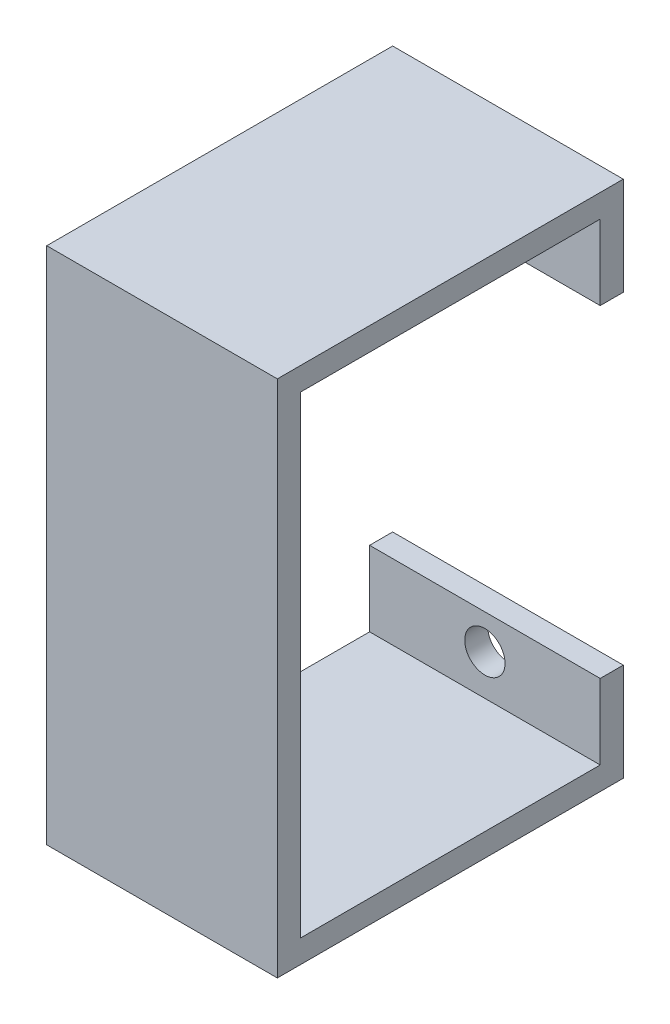
ISO-10303-21;
HEADER;
FILE_DESCRIPTION(('STEP AP214'),'2;1');
FILE_NAME('part.step','',(''),(''),'','','');
FILE_SCHEMA(('AUTOMOTIVE_DESIGN { 1 0 10303 214 1 1 1 1 }'));
ENDSEC;
DATA;
#1=APPLICATION_CONTEXT('core data for automotive mechanical design processes');
#2=APPLICATION_PROTOCOL_DEFINITION('international standard','automotive_design',2000,#1);
#3=PRODUCT_CONTEXT('',#1,'mechanical');
#4=PRODUCT('Part','Part','',(#3));
#5=PRODUCT_RELATED_PRODUCT_CATEGORY('part','',(#4));
#6=PRODUCT_DEFINITION_FORMATION('','',#4);
#7=PRODUCT_DEFINITION_CONTEXT('part definition',#1,'design');
#8=PRODUCT_DEFINITION('design','',#6,#7);
#9=PRODUCT_DEFINITION_SHAPE('','',#8);
#10=(LENGTH_UNIT() NAMED_UNIT(*) SI_UNIT(.MILLI.,.METRE.));
#11=(NAMED_UNIT(*) PLANE_ANGLE_UNIT() SI_UNIT($,.RADIAN.));
#12=(NAMED_UNIT(*) SI_UNIT($,.STERADIAN.) SOLID_ANGLE_UNIT());
#13=UNCERTAINTY_MEASURE_WITH_UNIT(LENGTH_MEASURE(1.E-05),#10,'distance_accuracy_value','');
#14=(GEOMETRIC_REPRESENTATION_CONTEXT(3) GLOBAL_UNCERTAINTY_ASSIGNED_CONTEXT((#13)) GLOBAL_UNIT_ASSIGNED_CONTEXT((#10,
#11,#12)) REPRESENTATION_CONTEXT('',''));
#15=CARTESIAN_POINT('',(0.,0.,0.));
#16=DIRECTION('',(0.,0.,1.));
#17=DIRECTION('',(1.,0.,0.));
#18=AXIS2_PLACEMENT_3D('',#15,#16,#17);
#19=CARTESIAN_POINT('',(10.,-14.,2.));
#20=DIRECTION('',(0.,-1.,0.));
#21=DIRECTION('',(0.,0.,-1.));
#22=AXIS2_PLACEMENT_3D('',#19,#20,#21);
#23=PLANE('',#22);
#24=DIRECTION('',(0.,0.,1.));
#25=VECTOR('',#24,1.);
#26=CARTESIAN_POINT('',(-10.,-14.,2.));
#27=LINE('',#26,#25);
#28=CARTESIAN_POINT('',(-10.,-14.,0.));
#29=VERTEX_POINT('',#28);
#30=CARTESIAN_POINT('',(-10.,-14.,2.));
#31=VERTEX_POINT('',#30);
#32=EDGE_CURVE('E153',#29,#31,#27,.T.);
#33=ORIENTED_EDGE('',*,*,#32,.T.);
#34=DIRECTION('',(-1.,0.,0.));
#35=VECTOR('',#34,1.);
#36=CARTESIAN_POINT('',(10.,-14.,2.));
#37=LINE('',#36,#35);
#38=CARTESIAN_POINT('',(10.,-14.,2.));
#39=VERTEX_POINT('',#38);
#40=EDGE_CURVE('E11',#39,#31,#37,.T.);
#41=ORIENTED_EDGE('',*,*,#40,.F.);
#42=DIRECTION('',(0.,0.,1.));
#43=VECTOR('',#42,1.);
#44=CARTESIAN_POINT('',(10.,-14.,2.));
#45=LINE('',#44,#43);
#46=CARTESIAN_POINT('',(10.,-14.,0.));
#47=VERTEX_POINT('',#46);
#48=EDGE_CURVE('E176',#47,#39,#45,.T.);
#49=ORIENTED_EDGE('',*,*,#48,.F.);
#50=DIRECTION('',(-1.,0.,0.));
#51=VECTOR('',#50,1.);
#52=CARTESIAN_POINT('',(10.,-14.,0.));
#53=LINE('',#52,#51);
#54=EDGE_CURVE('E149',#47,#29,#53,.T.);
#55=ORIENTED_EDGE('',*,*,#54,.T.);
#56=EDGE_LOOP('',(#33,#41,#49,#55));
#57=FACE_BOUND('',#56,.T.);
#58=ADVANCED_FACE('F33',(#57),#23,.F.);
#59=CARTESIAN_POINT('',(10.,-14.,2.));
#60=DIRECTION('',(0.,0.,-1.));
#61=DIRECTION('',(0.,1.,0.));
#62=AXIS2_PLACEMENT_3D('',#59,#60,#61);
#63=PLANE('',#62);
#64=CARTESIAN_POINT('',(0.,-17.,2.));
#65=DIRECTION('',(0.,0.,1.));
#66=DIRECTION('',(1.,0.,0.));
#67=AXIS2_PLACEMENT_3D('',#64,#65,#66);
#68=CIRCLE('',#67,1.75);
#69=CARTESIAN_POINT('',(1.75,-17.,2.));
#70=VERTEX_POINT('',#69);
#71=EDGE_CURVE('E363',#70,#70,#68,.T.);
#72=ORIENTED_EDGE('',*,*,#71,.F.);
#73=EDGE_LOOP('',(#72));
#74=FACE_BOUND('',#73,.T.);
#75=DIRECTION('',(0.,-1.,0.));
#76=VECTOR('',#75,1.);
#77=CARTESIAN_POINT('',(-10.,-14.,2.));
#78=LINE('',#77,#76);
#79=CARTESIAN_POINT('',(-10.,-20.5,2.));
#80=VERTEX_POINT('',#79);
#81=EDGE_CURVE('E156',#31,#80,#78,.T.);
#82=ORIENTED_EDGE('',*,*,#81,.T.);
#83=DIRECTION('',(-1.,0.,0.));
#84=VECTOR('',#83,1.);
#85=CARTESIAN_POINT('',(10.,-20.5,2.));
#86=LINE('',#85,#84);
#87=CARTESIAN_POINT('',(10.,-20.5,2.));
#88=VERTEX_POINT('',#87);
#89=EDGE_CURVE('E41',#88,#80,#86,.T.);
#90=ORIENTED_EDGE('',*,*,#89,.F.);
#91=DIRECTION('',(0.,-1.,0.));
#92=VECTOR('',#91,1.);
#93=CARTESIAN_POINT('',(10.,-14.,2.));
#94=LINE('',#93,#92);
#95=EDGE_CURVE('E104',#39,#88,#94,.T.);
#96=ORIENTED_EDGE('',*,*,#95,.F.);
#97=ORIENTED_EDGE('',*,*,#40,.T.);
#98=EDGE_LOOP('',(#82,#90,#96,#97));
#99=FACE_BOUND('',#98,.T.);
#100=ADVANCED_FACE('F256',(#74,#99),#63,.F.);
#101=CARTESIAN_POINT('',(10.,-20.5,2.));
#102=DIRECTION('',(0.,-1.,0.));
#103=DIRECTION('',(0.,0.,-1.));
#104=AXIS2_PLACEMENT_3D('',#101,#102,#103);
#105=PLANE('',#104);
#106=DIRECTION('',(0.,0.,1.));
#107=VECTOR('',#106,1.);
#108=CARTESIAN_POINT('',(-10.,-20.5,2.));
#109=LINE('',#108,#107);
#110=CARTESIAN_POINT('',(-10.,-20.5,28.));
#111=VERTEX_POINT('',#110);
#112=EDGE_CURVE('E159',#80,#111,#109,.T.);
#113=ORIENTED_EDGE('',*,*,#112,.T.);
#114=DIRECTION('',(-1.,0.,0.));
#115=VECTOR('',#114,1.);
#116=CARTESIAN_POINT('',(10.,-20.5,28.));
#117=LINE('',#116,#115);
#118=CARTESIAN_POINT('',(10.,-20.5,28.));
#119=VERTEX_POINT('',#118);
#120=EDGE_CURVE('E195',#119,#111,#117,.T.);
#121=ORIENTED_EDGE('',*,*,#120,.F.);
#122=DIRECTION('',(0.,0.,1.));
#123=VECTOR('',#122,1.);
#124=CARTESIAN_POINT('',(10.,-20.5,2.));
#125=LINE('',#124,#123);
#126=EDGE_CURVE('E203',#88,#119,#125,.T.);
#127=ORIENTED_EDGE('',*,*,#126,.F.);
#128=ORIENTED_EDGE('',*,*,#89,.T.);
#129=EDGE_LOOP('',(#113,#121,#127,#128));
#130=FACE_BOUND('',#129,.T.);
#131=ADVANCED_FACE('F201',(#130),#105,.F.);
#132=CARTESIAN_POINT('',(10.,-20.5,28.));
#133=DIRECTION('',(0.,0.,1.));
#134=DIRECTION('',(1.,0.,0.));
#135=AXIS2_PLACEMENT_3D('',#132,#133,#134);
#136=PLANE('',#135);
#137=DIRECTION('',(0.,1.,0.));
#138=VECTOR('',#137,1.);
#139=CARTESIAN_POINT('',(-10.,-20.5,28.));
#140=LINE('',#139,#138);
#141=CARTESIAN_POINT('',(-10.,20.5,28.));
#142=VERTEX_POINT('',#141);
#143=EDGE_CURVE('E161',#111,#142,#140,.T.);
#144=ORIENTED_EDGE('',*,*,#143,.T.);
#145=DIRECTION('',(-1.,0.,0.));
#146=VECTOR('',#145,1.);
#147=CARTESIAN_POINT('',(10.,20.5,28.));
#148=LINE('',#147,#146);
#149=CARTESIAN_POINT('',(10.,20.5,28.));
#150=VERTEX_POINT('',#149);
#151=EDGE_CURVE('E192',#150,#142,#148,.T.);
#152=ORIENTED_EDGE('',*,*,#151,.F.);
#153=DIRECTION('',(0.,1.,0.));
#154=VECTOR('',#153,1.);
#155=CARTESIAN_POINT('',(10.,-20.5,28.));
#156=LINE('',#155,#154);
#157=EDGE_CURVE('E221',#119,#150,#156,.T.);
#158=ORIENTED_EDGE('',*,*,#157,.F.);
#159=ORIENTED_EDGE('',*,*,#120,.T.);
#160=EDGE_LOOP('',(#144,#152,#158,#159));
#161=FACE_BOUND('',#160,.T.);
#162=ADVANCED_FACE('F212',(#161),#136,.F.);
#163=CARTESIAN_POINT('',(10.,20.5,28.));
#164=DIRECTION('',(0.,1.,0.));
#165=DIRECTION('',(0.,0.,1.));
#166=AXIS2_PLACEMENT_3D('',#163,#164,#165);
#167=PLANE('',#166);
#168=DIRECTION('',(0.,0.,-1.));
#169=VECTOR('',#168,1.);
#170=CARTESIAN_POINT('',(-10.,20.5,28.));
#171=LINE('',#170,#169);
#172=CARTESIAN_POINT('',(-10.,20.5,2.));
#173=VERTEX_POINT('',#172);
#174=EDGE_CURVE('E163',#142,#173,#171,.T.);
#175=ORIENTED_EDGE('',*,*,#174,.T.);
#176=DIRECTION('',(-1.,0.,0.));
#177=VECTOR('',#176,1.);
#178=CARTESIAN_POINT('',(10.,20.5,2.));
#179=LINE('',#178,#177);
#180=CARTESIAN_POINT('',(10.,20.5,2.));
#181=VERTEX_POINT('',#180);
#182=EDGE_CURVE('E189',#181,#173,#179,.T.);
#183=ORIENTED_EDGE('',*,*,#182,.F.);
#184=DIRECTION('',(0.,0.,-1.));
#185=VECTOR('',#184,1.);
#186=CARTESIAN_POINT('',(10.,20.5,28.));
#187=LINE('',#186,#185);
#188=EDGE_CURVE('E218',#150,#181,#187,.T.);
#189=ORIENTED_EDGE('',*,*,#188,.F.);
#190=ORIENTED_EDGE('',*,*,#151,.T.);
#191=EDGE_LOOP('',(#175,#183,#189,#190));
#192=FACE_BOUND('',#191,.T.);
#193=ADVANCED_FACE('F216',(#192),#167,.F.);
#194=CARTESIAN_POINT('',(10.,20.5,2.));
#195=DIRECTION('',(0.,0.,-1.));
#196=DIRECTION('',(-1.,0.,0.));
#197=AXIS2_PLACEMENT_3D('',#194,#195,#196);
#198=PLANE('',#197);
#199=CARTESIAN_POINT('',(0.,17.,2.));
#200=DIRECTION('',(0.,0.,1.));
#201=DIRECTION('',(-1.,0.,0.));
#202=AXIS2_PLACEMENT_3D('',#199,#200,#201);
#203=CIRCLE('',#202,1.75);
#204=CARTESIAN_POINT('',(-1.75,17.,2.));
#205=VERTEX_POINT('',#204);
#206=EDGE_CURVE('E361',#205,#205,#203,.T.);
#207=ORIENTED_EDGE('',*,*,#206,.F.);
#208=EDGE_LOOP('',(#207));
#209=FACE_BOUND('',#208,.T.);
#210=DIRECTION('',(0.,-1.,0.));
#211=VECTOR('',#210,1.);
#212=CARTESIAN_POINT('',(-10.,20.5,2.));
#213=LINE('',#212,#211);
#214=CARTESIAN_POINT('',(-10.,14.,2.));
#215=VERTEX_POINT('',#214);
#216=EDGE_CURVE('E165',#173,#215,#213,.T.);
#217=ORIENTED_EDGE('',*,*,#216,.T.);
#218=DIRECTION('',(-1.,0.,0.));
#219=VECTOR('',#218,1.);
#220=CARTESIAN_POINT('',(10.,14.,2.));
#221=LINE('',#220,#219);
#222=CARTESIAN_POINT('',(10.,14.,2.));
#223=VERTEX_POINT('',#222);
#224=EDGE_CURVE('E186',#223,#215,#221,.T.);
#225=ORIENTED_EDGE('',*,*,#224,.F.);
#226=DIRECTION('',(0.,-1.,0.));
#227=VECTOR('',#226,1.);
#228=CARTESIAN_POINT('',(10.,20.5,2.));
#229=LINE('',#228,#227);
#230=EDGE_CURVE('E220',#181,#223,#229,.T.);
#231=ORIENTED_EDGE('',*,*,#230,.F.);
#232=ORIENTED_EDGE('',*,*,#182,.T.);
#233=EDGE_LOOP('',(#217,#225,#231,#232));
#234=FACE_BOUND('',#233,.T.);
#235=ADVANCED_FACE('F271',(#209,#234),#198,.F.);
#236=CARTESIAN_POINT('',(10.,14.,2.));
#237=DIRECTION('',(0.,1.,0.));
#238=DIRECTION('',(0.,0.,1.));
#239=AXIS2_PLACEMENT_3D('',#236,#237,#238);
#240=PLANE('',#239);
#241=DIRECTION('',(0.,0.,-1.));
#242=VECTOR('',#241,1.);
#243=CARTESIAN_POINT('',(-10.,14.,2.));
#244=LINE('',#243,#242);
#245=CARTESIAN_POINT('',(-10.,14.,0.));
#246=VERTEX_POINT('',#245);
#247=EDGE_CURVE('E167',#215,#246,#244,.T.);
#248=ORIENTED_EDGE('',*,*,#247,.T.);
#249=DIRECTION('',(-1.,0.,0.));
#250=VECTOR('',#249,1.);
#251=CARTESIAN_POINT('',(10.,14.,0.));
#252=LINE('',#251,#250);
#253=CARTESIAN_POINT('',(10.,14.,0.));
#254=VERTEX_POINT('',#253);
#255=EDGE_CURVE('E183',#254,#246,#252,.T.);
#256=ORIENTED_EDGE('',*,*,#255,.F.);
#257=DIRECTION('',(0.,0.,-1.));
#258=VECTOR('',#257,1.);
#259=CARTESIAN_POINT('',(10.,14.,2.));
#260=LINE('',#259,#258);
#261=EDGE_CURVE('E223',#223,#254,#260,.T.);
#262=ORIENTED_EDGE('',*,*,#261,.F.);
#263=ORIENTED_EDGE('',*,*,#224,.T.);
#264=EDGE_LOOP('',(#248,#256,#262,#263));
#265=FACE_BOUND('',#264,.T.);
#266=ADVANCED_FACE('F274',(#265),#240,.F.);
#267=CARTESIAN_POINT('',(10.,22.5,0.));
#268=DIRECTION('',(0.,0.,1.));
#269=DIRECTION('',(0.,-1.,0.));
#270=AXIS2_PLACEMENT_3D('',#267,#268,#269);
#271=PLANE('',#270);
#272=CARTESIAN_POINT('',(0.,17.,0.));
#273=DIRECTION('',(0.,0.,1.));
#274=DIRECTION('',(-1.,0.,0.));
#275=AXIS2_PLACEMENT_3D('',#272,#273,#274);
#276=CIRCLE('',#275,1.75);
#277=CARTESIAN_POINT('',(-1.75,17.,0.));
#278=VERTEX_POINT('',#277);
#279=EDGE_CURVE('E358',#278,#278,#276,.T.);
#280=ORIENTED_EDGE('',*,*,#279,.T.);
#281=EDGE_LOOP('',(#280));
#282=FACE_BOUND('',#281,.T.);
#283=DIRECTION('',(0.,1.,0.));
#284=VECTOR('',#283,1.);
#285=CARTESIAN_POINT('',(-10.,22.5,0.));
#286=LINE('',#285,#284);
#287=CARTESIAN_POINT('',(-10.,22.5,0.));
#288=VERTEX_POINT('',#287);
#289=EDGE_CURVE('E169',#246,#288,#286,.T.);
#290=ORIENTED_EDGE('',*,*,#289,.T.);
#291=DIRECTION('',(-1.,0.,0.));
#292=VECTOR('',#291,1.);
#293=CARTESIAN_POINT('',(10.,22.5,0.));
#294=LINE('',#293,#292);
#295=CARTESIAN_POINT('',(10.,22.5,0.));
#296=VERTEX_POINT('',#295);
#297=EDGE_CURVE('E180',#296,#288,#294,.T.);
#298=ORIENTED_EDGE('',*,*,#297,.F.);
#299=DIRECTION('',(0.,1.,0.));
#300=VECTOR('',#299,1.);
#301=CARTESIAN_POINT('',(10.,22.5,0.));
#302=LINE('',#301,#300);
#303=EDGE_CURVE('E229',#254,#296,#302,.T.);
#304=ORIENTED_EDGE('',*,*,#303,.F.);
#305=ORIENTED_EDGE('',*,*,#255,.T.);
#306=EDGE_LOOP('',(#290,#298,#304,#305));
#307=FACE_BOUND('',#306,.T.);
#308=ADVANCED_FACE('F235',(#282,#307),#271,.F.);
#309=CARTESIAN_POINT('',(10.,22.5,30.));
#310=DIRECTION('',(0.,-1.,0.));
#311=DIRECTION('',(0.,0.,-1.));
#312=AXIS2_PLACEMENT_3D('',#309,#310,#311);
#313=PLANE('',#312);
#314=DIRECTION('',(0.,0.,1.));
#315=VECTOR('',#314,1.);
#316=CARTESIAN_POINT('',(-10.,22.5,30.));
#317=LINE('',#316,#315);
#318=CARTESIAN_POINT('',(-10.,22.5,30.));
#319=VERTEX_POINT('',#318);
#320=EDGE_CURVE('E171',#288,#319,#317,.T.);
#321=ORIENTED_EDGE('',*,*,#320,.T.);
#322=DIRECTION('',(-1.,0.,0.));
#323=VECTOR('',#322,1.);
#324=CARTESIAN_POINT('',(10.,22.5,30.));
#325=LINE('',#324,#323);
#326=CARTESIAN_POINT('',(10.,22.5,30.));
#327=VERTEX_POINT('',#326);
#328=EDGE_CURVE('E144',#327,#319,#325,.T.);
#329=ORIENTED_EDGE('',*,*,#328,.F.);
#330=DIRECTION('',(0.,0.,1.));
#331=VECTOR('',#330,1.);
#332=CARTESIAN_POINT('',(10.,22.5,30.));
#333=LINE('',#332,#331);
#334=EDGE_CURVE('E135',#296,#327,#333,.T.);
#335=ORIENTED_EDGE('',*,*,#334,.F.);
#336=ORIENTED_EDGE('',*,*,#297,.T.);
#337=EDGE_LOOP('',(#321,#329,#335,#336));
#338=FACE_BOUND('',#337,.T.);
#339=ADVANCED_FACE('F239',(#338),#313,.F.);
#340=CARTESIAN_POINT('',(10.,-22.5,30.));
#341=DIRECTION('',(0.,0.,-1.));
#342=DIRECTION('',(-1.,0.,0.));
#343=AXIS2_PLACEMENT_3D('',#340,#341,#342);
#344=PLANE('',#343);
#345=DIRECTION('',(0.,-1.,0.));
#346=VECTOR('',#345,1.);
#347=CARTESIAN_POINT('',(-10.,-22.5,30.));
#348=LINE('',#347,#346);
#349=CARTESIAN_POINT('',(-10.,-22.5,30.));
#350=VERTEX_POINT('',#349);
#351=EDGE_CURVE('E143',#319,#350,#348,.T.);
#352=ORIENTED_EDGE('',*,*,#351,.T.);
#353=DIRECTION('',(-1.,0.,0.));
#354=VECTOR('',#353,1.);
#355=CARTESIAN_POINT('',(10.,-22.5,30.));
#356=LINE('',#355,#354);
#357=CARTESIAN_POINT('',(10.,-22.5,30.));
#358=VERTEX_POINT('',#357);
#359=EDGE_CURVE('E140',#358,#350,#356,.T.);
#360=ORIENTED_EDGE('',*,*,#359,.F.);
#361=DIRECTION('',(0.,-1.,0.));
#362=VECTOR('',#361,1.);
#363=CARTESIAN_POINT('',(10.,-22.5,30.));
#364=LINE('',#363,#362);
#365=EDGE_CURVE('E129',#327,#358,#364,.T.);
#366=ORIENTED_EDGE('',*,*,#365,.F.);
#367=ORIENTED_EDGE('',*,*,#328,.T.);
#368=EDGE_LOOP('',(#352,#360,#366,#367));
#369=FACE_BOUND('',#368,.T.);
#370=ADVANCED_FACE('F141',(#369),#344,.F.);
#371=CARTESIAN_POINT('',(10.,-22.5,0.));
#372=DIRECTION('',(0.,1.,0.));
#373=DIRECTION('',(0.,0.,1.));
#374=AXIS2_PLACEMENT_3D('',#371,#372,#373);
#375=PLANE('',#374);
#376=DIRECTION('',(0.,0.,-1.));
#377=VECTOR('',#376,1.);
#378=CARTESIAN_POINT('',(-10.,-22.5,0.));
#379=LINE('',#378,#377);
#380=CARTESIAN_POINT('',(-10.,-22.5,0.));
#381=VERTEX_POINT('',#380);
#382=EDGE_CURVE('E90',#350,#381,#379,.T.);
#383=ORIENTED_EDGE('',*,*,#382,.T.);
#384=DIRECTION('',(-1.,0.,0.));
#385=VECTOR('',#384,1.);
#386=CARTESIAN_POINT('',(10.,-22.5,0.));
#387=LINE('',#386,#385);
#388=CARTESIAN_POINT('',(10.,-22.5,0.));
#389=VERTEX_POINT('',#388);
#390=EDGE_CURVE('E145',#389,#381,#387,.T.);
#391=ORIENTED_EDGE('',*,*,#390,.F.);
#392=DIRECTION('',(0.,0.,-1.));
#393=VECTOR('',#392,1.);
#394=CARTESIAN_POINT('',(10.,-22.5,0.));
#395=LINE('',#394,#393);
#396=EDGE_CURVE('E133',#358,#389,#395,.T.);
#397=ORIENTED_EDGE('',*,*,#396,.F.);
#398=ORIENTED_EDGE('',*,*,#359,.T.);
#399=EDGE_LOOP('',(#383,#391,#397,#398));
#400=FACE_BOUND('',#399,.T.);
#401=ADVANCED_FACE('F147',(#400),#375,.F.);
#402=CARTESIAN_POINT('',(10.,-14.,0.));
#403=DIRECTION('',(0.,0.,1.));
#404=DIRECTION('',(0.,-1.,0.));
#405=AXIS2_PLACEMENT_3D('',#402,#403,#404);
#406=PLANE('',#405);
#407=CARTESIAN_POINT('',(0.,-17.,0.));
#408=DIRECTION('',(0.,0.,1.));
#409=DIRECTION('',(1.,0.,0.));
#410=AXIS2_PLACEMENT_3D('',#407,#408,#409);
#411=CIRCLE('',#410,1.75);
#412=CARTESIAN_POINT('',(1.75,-17.,0.));
#413=VERTEX_POINT('',#412);
#414=EDGE_CURVE('E157',#413,#413,#411,.T.);
#415=ORIENTED_EDGE('',*,*,#414,.T.);
#416=EDGE_LOOP('',(#415));
#417=FACE_BOUND('',#416,.T.);
#418=DIRECTION('',(0.,1.,0.));
#419=VECTOR('',#418,1.);
#420=CARTESIAN_POINT('',(-10.,-14.,0.));
#421=LINE('',#420,#419);
#422=EDGE_CURVE('E96',#381,#29,#421,.T.);
#423=ORIENTED_EDGE('',*,*,#422,.T.);
#424=ORIENTED_EDGE('',*,*,#54,.F.);
#425=DIRECTION('',(0.,1.,0.));
#426=VECTOR('',#425,1.);
#427=CARTESIAN_POINT('',(10.,-14.,0.));
#428=LINE('',#427,#426);
#429=EDGE_CURVE('E49',#389,#47,#428,.T.);
#430=ORIENTED_EDGE('',*,*,#429,.F.);
#431=ORIENTED_EDGE('',*,*,#390,.T.);
#432=EDGE_LOOP('',(#423,#424,#430,#431));
#433=FACE_BOUND('',#432,.T.);
#434=ADVANCED_FACE('F243',(#417,#433),#406,.F.);
#435=CARTESIAN_POINT('',(10.,0.,0.));
#436=DIRECTION('',(-1.,0.,0.));
#437=DIRECTION('',(0.,0.,1.));
#438=AXIS2_PLACEMENT_3D('',#435,#436,#437);
#439=PLANE('',#438);
#440=ORIENTED_EDGE('',*,*,#48,.T.);
#441=ORIENTED_EDGE('',*,*,#95,.T.);
#442=ORIENTED_EDGE('',*,*,#126,.T.);
#443=ORIENTED_EDGE('',*,*,#157,.T.);
#444=ORIENTED_EDGE('',*,*,#188,.T.);
#445=ORIENTED_EDGE('',*,*,#230,.T.);
#446=ORIENTED_EDGE('',*,*,#261,.T.);
#447=ORIENTED_EDGE('',*,*,#303,.T.);
#448=ORIENTED_EDGE('',*,*,#334,.T.);
#449=ORIENTED_EDGE('',*,*,#365,.T.);
#450=ORIENTED_EDGE('',*,*,#396,.T.);
#451=ORIENTED_EDGE('',*,*,#429,.T.);
#452=EDGE_LOOP('',(#440,#441,#442,#443,#444,#445,#446,#447,#448,#449,#450,#451));
#453=FACE_BOUND('',#452,.T.);
#454=ADVANCED_FACE('F131',(#453),#439,.F.);
#455=CARTESIAN_POINT('',(-10.,0.,0.));
#456=DIRECTION('',(-1.,0.,0.));
#457=DIRECTION('',(0.,0.,1.));
#458=AXIS2_PLACEMENT_3D('',#455,#456,#457);
#459=PLANE('',#458);
#460=ORIENTED_EDGE('',*,*,#32,.F.);
#461=ORIENTED_EDGE('',*,*,#422,.F.);
#462=ORIENTED_EDGE('',*,*,#382,.F.);
#463=ORIENTED_EDGE('',*,*,#351,.F.);
#464=ORIENTED_EDGE('',*,*,#320,.F.);
#465=ORIENTED_EDGE('',*,*,#289,.F.);
#466=ORIENTED_EDGE('',*,*,#247,.F.);
#467=ORIENTED_EDGE('',*,*,#216,.F.);
#468=ORIENTED_EDGE('',*,*,#174,.F.);
#469=ORIENTED_EDGE('',*,*,#143,.F.);
#470=ORIENTED_EDGE('',*,*,#112,.F.);
#471=ORIENTED_EDGE('',*,*,#81,.F.);
#472=EDGE_LOOP('',(#460,#461,#462,#463,#464,#465,#466,#467,#468,#469,#470,#471));
#473=FACE_BOUND('',#472,.T.);
#474=ADVANCED_FACE('F207',(#473),#459,.T.);
#475=CARTESIAN_POINT('',(0.,-17.,0.));
#476=DIRECTION('',(0.,0.,1.));
#477=DIRECTION('',(1.,0.,0.));
#478=AXIS2_PLACEMENT_3D('',#475,#476,#477);
#479=CYLINDRICAL_SURFACE('',#478,1.75);
#480=ORIENTED_EDGE('',*,*,#414,.F.);
#481=EDGE_LOOP('',(#480));
#482=FACE_BOUND('',#481,.T.);
#483=ORIENTED_EDGE('',*,*,#71,.T.);
#484=EDGE_LOOP('',(#483));
#485=FACE_BOUND('',#484,.T.);
#486=ADVANCED_FACE('F308',(#482,#485),#479,.F.);
#487=CARTESIAN_POINT('',(0.,17.,0.));
#488=DIRECTION('',(0.,0.,1.));
#489=DIRECTION('',(1.,0.,0.));
#490=AXIS2_PLACEMENT_3D('',#487,#488,#489);
#491=CYLINDRICAL_SURFACE('',#490,1.75);
#492=ORIENTED_EDGE('',*,*,#279,.F.);
#493=EDGE_LOOP('',(#492));
#494=FACE_BOUND('',#493,.T.);
#495=ORIENTED_EDGE('',*,*,#206,.T.);
#496=EDGE_LOOP('',(#495));
#497=FACE_BOUND('',#496,.T.);
#498=ADVANCED_FACE('F341',(#494,#497),#491,.F.);
#499=CLOSED_SHELL('',(#58,#100,#131,#162,#193,#235,#266,#308,#339,#370,#401,#434,#454,#474,#486,#498));
#500=MANIFOLD_SOLID_BREP('B2',#499);
#501=ADVANCED_BREP_SHAPE_REPRESENTATION('',(#18,#500),#14);
#502=SHAPE_DEFINITION_REPRESENTATION(#9,#501);
ENDSEC;
END-ISO-10303-21;
